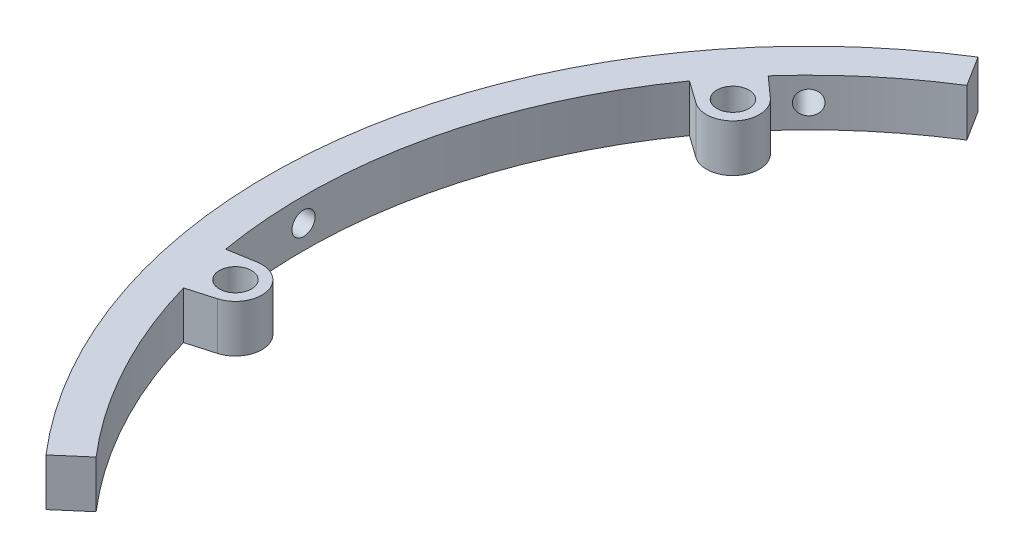
ISO-10303-21;
HEADER;
FILE_DESCRIPTION(('STEP AP214'),'2;1');
FILE_NAME('part.step','',(''),(''),'','','');
FILE_SCHEMA(('AUTOMOTIVE_DESIGN { 1 0 10303 214 1 1 1 1 }'));
ENDSEC;
DATA;
#1=APPLICATION_CONTEXT('core data for automotive mechanical design processes');
#2=APPLICATION_PROTOCOL_DEFINITION('international standard','automotive_design',2000,#1);
#3=PRODUCT_CONTEXT('',#1,'mechanical');
#4=PRODUCT('Part','Part','',(#3));
#5=PRODUCT_RELATED_PRODUCT_CATEGORY('part','',(#4));
#6=PRODUCT_DEFINITION_FORMATION('','',#4);
#7=PRODUCT_DEFINITION_CONTEXT('part definition',#1,'design');
#8=PRODUCT_DEFINITION('design','',#6,#7);
#9=PRODUCT_DEFINITION_SHAPE('','',#8);
#10=(LENGTH_UNIT() NAMED_UNIT(*) SI_UNIT(.MILLI.,.METRE.));
#11=(NAMED_UNIT(*) PLANE_ANGLE_UNIT() SI_UNIT($,.RADIAN.));
#12=(NAMED_UNIT(*) SI_UNIT($,.STERADIAN.) SOLID_ANGLE_UNIT());
#13=UNCERTAINTY_MEASURE_WITH_UNIT(LENGTH_MEASURE(1.E-05),#10,'distance_accuracy_value','');
#14=(GEOMETRIC_REPRESENTATION_CONTEXT(3) GLOBAL_UNCERTAINTY_ASSIGNED_CONTEXT((#13)) GLOBAL_UNIT_ASSIGNED_CONTEXT((#10,
#11,#12)) REPRESENTATION_CONTEXT('',''));
#15=CARTESIAN_POINT('',(0.,0.,0.));
#16=DIRECTION('',(0.,0.,1.));
#17=DIRECTION('',(1.,0.,0.));
#18=AXIS2_PLACEMENT_3D('',#15,#16,#17);
#19=CARTESIAN_POINT('',(0.,0.,0.));
#20=DIRECTION('',(0.,1.,0.));
#21=DIRECTION('',(0.,0.,1.));
#22=AXIS2_PLACEMENT_3D('',#19,#20,#21);
#23=PLANE('',#22);
#24=CARTESIAN_POINT('',(-62.5723357956977,0.,14.2817273227174));
#25=DIRECTION('',(0.,1.,0.));
#26=DIRECTION('',(0.,0.,1.));
#27=AXIS2_PLACEMENT_3D('',#24,#25,#26);
#28=CIRCLE('',#27,2.15265);
#29=CARTESIAN_POINT('',(-62.5723357956977,0.,16.4343773227174));
#30=VERTEX_POINT('',#29);
#31=EDGE_CURVE('E476',#30,#30,#28,.T.);
#32=ORIENTED_EDGE('',*,*,#31,.T.);
#33=EDGE_LOOP('',(#32));
#34=FACE_BOUND('',#33,.T.);
#35=CARTESIAN_POINT('',(-50.1791172920219,0.,-40.0165107179962));
#36=DIRECTION('',(0.,1.,0.));
#37=DIRECTION('',(0.,0.,1.));
#38=AXIS2_PLACEMENT_3D('',#35,#36,#37);
#39=CIRCLE('',#38,2.15265);
#40=CARTESIAN_POINT('',(-50.1791172920219,0.,-37.8638607179962));
#41=VERTEX_POINT('',#40);
#42=EDGE_CURVE('E409',#41,#41,#39,.T.);
#43=ORIENTED_EDGE('',*,*,#42,.T.);
#44=EDGE_LOOP('',(#43));
#45=FACE_BOUND('',#44,.T.);
#46=DIRECTION('',(-0.533066975566378,0.,-0.846073046232129));
#47=VECTOR('',#46,1.);
#48=CARTESIAN_POINT('',(1.64382710877289E-13,0.,-1.03569065239691E-13));
#49=LINE('',#48,#47);
#50=CARTESIAN_POINT('',(-36.1086242574274,0.,-57.310872969149));
#51=VERTEX_POINT('',#50);
#52=CARTESIAN_POINT('',(-38.6473557285622,0.,-61.3402958518295));
#53=VERTEX_POINT('',#52);
#54=EDGE_CURVE('E270',#51,#53,#49,.T.);
#55=ORIENTED_EDGE('',*,*,#54,.F.);
#56=CARTESIAN_POINT('',(0.,0.,0.));
#57=DIRECTION('',(0.,1.,0.));
#58=DIRECTION('',(0.,0.,1.));
#59=AXIS2_PLACEMENT_3D('',#56,#57,#58);
#60=CIRCLE('',#59,67.7375);
#61=CARTESIAN_POINT('',(-50.5379908631706,0.,-45.1029975252653));
#62=VERTEX_POINT('',#61);
#63=EDGE_CURVE('E295',#51,#62,#60,.T.);
#64=ORIENTED_EDGE('',*,*,#63,.T.);
#65=DIRECTION('',(-0.746085858839943,0.,-0.665849751249533));
#66=VECTOR('',#65,1.);
#67=CARTESIAN_POINT('',(0.,0.,0.));
#68=LINE('',#67,#66);
#69=CARTESIAN_POINT('',(-47.8113555765786,0.,-42.669592032031));
#70=VERTEX_POINT('',#69);
#71=EDGE_CURVE('E420',#70,#62,#68,.T.);
#72=ORIENTED_EDGE('',*,*,#71,.F.);
#73=CARTESIAN_POINT('',(-50.1791172920219,0.,-40.0165107179962));
#74=DIRECTION('',(0.,1.,0.));
#75=DIRECTION('',(0.,0.,1.));
#76=AXIS2_PLACEMENT_3D('',#73,#74,#75);
#77=CIRCLE('',#76,3.55600000000001);
#78=CARTESIAN_POINT('',(-52.238803770056,0.,-37.1177476003539));
#79=VERTEX_POINT('',#78);
#80=EDGE_CURVE('E416',#79,#70,#77,.T.);
#81=ORIENTED_EDGE('',*,*,#80,.F.);
#82=DIRECTION('',(-0.815175229933159,0.,-0.579214420144579));
#83=VECTOR('',#82,1.);
#84=CARTESIAN_POINT('',(0.,0.,0.));
#85=LINE('',#84,#83);
#86=CARTESIAN_POINT('',(-55.2179321375974,0.,-39.2345367845434));
#87=VERTEX_POINT('',#86);
#88=EDGE_CURVE('E413',#79,#87,#85,.T.);
#89=ORIENTED_EDGE('',*,*,#88,.T.);
#90=CARTESIAN_POINT('',(-66.7728653285467,0.,11.3909333272459));
#91=VERTEX_POINT('',#90);
#92=EDGE_CURVE('E301',#87,#91,#60,.T.);
#93=ORIENTED_EDGE('',*,*,#92,.T.);
#94=DIRECTION('',(-0.98575922241811,0.,0.168162883591009));
#95=VECTOR('',#94,1.);
#96=CARTESIAN_POINT('',(0.,0.,0.));
#97=LINE('',#96,#95);
#98=CARTESIAN_POINT('',(-63.1703230097473,0.,10.7763675277986));
#99=VERTEX_POINT('',#98);
#100=EDGE_CURVE('E406',#99,#91,#97,.T.);
#101=ORIENTED_EDGE('',*,*,#100,.F.);
#102=CARTESIAN_POINT('',(-62.5723357956977,0.,14.2817273227174));
#103=DIRECTION('',(0.,1.,0.));
#104=DIRECTION('',(0.781831482468031,0.,0.623489801858732));
#105=AXIS2_PLACEMENT_3D('',#102,#103,#104);
#106=CIRCLE('',#105,3.55600000000001);
#107=CARTESIAN_POINT('',(-61.5901850441883,0.,17.6994042971124));
#108=VERTEX_POINT('',#107);
#109=EDGE_CURVE('E394',#108,#99,#106,.T.);
#110=ORIENTED_EDGE('',*,*,#109,.F.);
#111=DIRECTION('',(-0.961101511359669,0.,0.276195374440196));
#112=VECTOR('',#111,1.);
#113=CARTESIAN_POINT('',(0.,0.,0.));
#114=LINE('',#113,#112);
#115=CARTESIAN_POINT('',(-65.1026136257256,0.,18.7087841761428));
#116=VERTEX_POINT('',#115);
#117=EDGE_CURVE('E391',#108,#116,#114,.T.);
#118=ORIENTED_EDGE('',*,*,#117,.T.);
#119=CARTESIAN_POINT('',(-51.325097149787,0.,44.2052407392486));
#120=VERTEX_POINT('',#119);
#121=EDGE_CURVE('E303',#116,#120,#60,.T.);
#122=ORIENTED_EDGE('',*,*,#121,.T.);
#123=DIRECTION('',(0.757705807710456,0.,-0.652596283288409));
#124=VECTOR('',#123,1.);
#125=CARTESIAN_POINT('',(0.,0.,0.));
#126=LINE('',#125,#124);
#127=CARTESIAN_POINT('',(-54.933671059008,0.,47.3132305384097));
#128=VERTEX_POINT('',#127);
#129=EDGE_CURVE('E293',#128,#120,#126,.T.);
#130=ORIENTED_EDGE('',*,*,#129,.F.);
#131=CARTESIAN_POINT('',(0.,0.,0.));
#132=DIRECTION('',(0.,1.,0.));
#133=DIRECTION('',(0.,0.,1.));
#134=AXIS2_PLACEMENT_3D('',#131,#132,#133);
#135=CIRCLE('',#134,72.5);
#136=EDGE_CURVE('E284',#53,#128,#135,.T.);
#137=ORIENTED_EDGE('',*,*,#136,.F.);
#138=EDGE_LOOP('',(#55,#64,#72,#81,#89,#93,#101,#110,#118,#122,#130,#137));
#139=FACE_BOUND('',#138,.T.);
#140=ADVANCED_FACE('F181',(#34,#45,#139),#23,.F.);
#141=CARTESIAN_POINT('',(0.,6.35,0.));
#142=DIRECTION('',(0.,-1.,0.));
#143=DIRECTION('',(0.,0.,-1.));
#144=AXIS2_PLACEMENT_3D('',#141,#142,#143);
#145=CYLINDRICAL_SURFACE('',#144,72.5);
#146=CARTESIAN_POINT('',(-72.4834291407353,3.175,-1.54999999999923));
#147=CARTESIAN_POINT('',(-72.4834293645865,3.08794649460173,-1.54999614282025));
#148=CARTESIAN_POINT('',(-72.4835876536211,3.00083012041106,-1.54264153620552));
#149=CARTESIAN_POINT('',(-72.4842038709039,2.82899733465025,-1.51340502004667));
#150=CARTESIAN_POINT('',(-72.4846621584129,2.74428392779969,-1.4915056921288));
#151=CARTESIAN_POINT('',(-72.4858264336809,2.57977132169415,-1.43380409898447));
#152=CARTESIAN_POINT('',(-72.4865323016569,2.49996976792119,-1.39800855605564));
#153=CARTESIAN_POINT('',(-72.4881120469524,2.34753098072984,-1.31354007886273));
#154=CARTESIAN_POINT('',(-72.4889858828685,2.27489198843442,-1.264870316926));
#155=CARTESIAN_POINT('',(-72.4908034158351,2.13879576893882,-1.15601689632958));
#156=CARTESIAN_POINT('',(-72.4917471301172,2.07534081796946,-1.09583039184134));
#157=CARTESIAN_POINT('',(-72.4935978984021,1.95943283628672,-0.965656199914587));
#158=CARTESIAN_POINT('',(-72.4945049509538,1.90698024070692,-0.895668125014984));
#159=CARTESIAN_POINT('',(-72.4961801785539,1.81456501832349,-0.747872466119339));
#160=CARTESIAN_POINT('',(-72.4969483428901,1.77460335476172,-0.670064279684264));
#161=CARTESIAN_POINT('',(-72.4982590994414,1.70831080012777,-0.508841465811591));
#162=CARTESIAN_POINT('',(-72.4988016923388,1.68197986782065,-0.425426855335101));
#163=CARTESIAN_POINT('',(-72.4996000652003,1.64370000370054,-0.255372498846873));
#164=CARTESIAN_POINT('',(-72.4998558890496,1.63174887127802,-0.168733248409883));
#165=CARTESIAN_POINT('',(-72.5000520309418,1.62256109160158,0.00532212861477915));
#166=CARTESIAN_POINT('',(-72.4999923499038,1.62532440148241,0.0927382529385673));
#167=CARTESIAN_POINT('',(-72.4995642484993,1.64548516364501,0.265851019051876));
#168=CARTESIAN_POINT('',(-72.4991958785157,1.66288022779647,0.351547939105494));
#169=CARTESIAN_POINT('',(-72.4981919804269,1.71180702970131,0.518804911355798));
#170=CARTESIAN_POINT('',(-72.4975564518844,1.74333879059684,0.600364956780068));
#171=CARTESIAN_POINT('',(-72.4960897888275,1.81964664619961,0.75704059225386));
#172=CARTESIAN_POINT('',(-72.4952586381378,1.86442383619415,0.832155648693238));
#173=CARTESIAN_POINT('',(-72.4934944179147,1.96595064697222,0.973803170030416));
#174=CARTESIAN_POINT('',(-72.4925613482832,2.02270027926998,1.040335626674));
#175=CARTESIAN_POINT('',(-72.4906982443746,2.14657458709075,1.16294326893115));
#176=CARTESIAN_POINT('',(-72.4897682107427,2.21370133764071,1.21901635811186));
#177=CARTESIAN_POINT('',(-72.4880162203671,2.35641705236178,1.31909740104073));
#178=CARTESIAN_POINT('',(-72.4871942636392,2.43200601776742,1.36310535302875));
#179=CARTESIAN_POINT('',(-72.4857511159742,2.58950158845738,1.43780663410852));
#180=CARTESIAN_POINT('',(-72.4851299260122,2.67140822442425,1.46849989853107));
#181=CARTESIAN_POINT('',(-72.4841583933322,2.8392135494842,1.51569918892468));
#182=CARTESIAN_POINT('',(-72.4838080502336,2.92511223296613,1.53220523483641));
#183=CARTESIAN_POINT('',(-72.4834177797798,3.09844504439566,1.55055897105741));
#184=CARTESIAN_POINT('',(-72.4833777909707,3.18587886493088,1.5524095633242));
#185=CARTESIAN_POINT('',(-72.4836125774907,3.35981599439132,1.54140741931125));
#186=CARTESIAN_POINT('',(-72.4838873526415,3.44631930384314,1.52855469135289));
#187=CARTESIAN_POINT('',(-72.4847206340846,3.61593178136506,1.48851315536335));
#188=CARTESIAN_POINT('',(-72.485279114334,3.69904126021759,1.4613256631923));
#189=CARTESIAN_POINT('',(-72.4866168228585,3.85951639847273,1.39338769993699));
#190=CARTESIAN_POINT('',(-72.4873960513454,3.93688205236578,1.3526372158431));
#191=CARTESIAN_POINT('',(-72.4890875594073,4.08368675544547,1.25872255610789));
#192=CARTESIAN_POINT('',(-72.489999859929,4.15312455364386,1.20555642534019));
#193=CARTESIAN_POINT('',(-72.4918545883852,4.28208988758413,1.08832254576978));
#194=CARTESIAN_POINT('',(-72.4927970163648,4.3416174085159,1.02425478067574));
#195=CARTESIAN_POINT('',(-72.4946059325317,4.44908205447166,0.887023883352549));
#196=CARTESIAN_POINT('',(-72.4954724084378,4.4970173072617,0.813859284805302));
#197=CARTESIAN_POINT('',(-72.4970315640006,4.5799238719632,0.660519162219565));
#198=CARTESIAN_POINT('',(-72.4977242439467,4.61489520545833,0.580343649853848));
#199=CARTESIAN_POINT('',(-72.4988576608027,4.67087795671412,0.415264676914085));
#200=CARTESIAN_POINT('',(-72.4992984197022,4.69189059292011,0.330361629704772));
#201=CARTESIAN_POINT('',(-72.4998783935025,4.71936348126115,0.158231752679397));
#202=CARTESIAN_POINT('',(-72.5000176082698,4.72582372695725,0.0710049218351581));
#203=CARTESIAN_POINT('',(-72.4999788002703,4.72400828086903,-0.103277565910435));
#204=CARTESIAN_POINT('',(-72.4998008412853,4.71573555180286,-0.190333253703454));
#205=CARTESIAN_POINT('',(-72.4991478683034,4.68469505478808,-0.361819908355045));
#206=CARTESIAN_POINT('',(-72.4986728537133,4.66192725789381,-0.446250869971867));
#207=CARTESIAN_POINT('',(-72.4974792926782,4.60254306436209,-0.61009317468893));
#208=CARTESIAN_POINT('',(-72.4967607418624,4.56592641917408,-0.689504427668684));
#209=CARTESIAN_POINT('',(-72.495161113077,4.47988573773347,-0.841049986484441));
#210=CARTESIAN_POINT('',(-72.4942800412333,4.4304621841738,-0.913184566436236));
#211=CARTESIAN_POINT('',(-72.4924545323763,4.32020487244231,-1.04814092501514));
#212=CARTESIAN_POINT('',(-72.4915100893709,4.259370034242,-1.11096182113414));
#213=CARTESIAN_POINT('',(-72.4896641177195,4.12799946117098,-1.22551534310395));
#214=CARTESIAN_POINT('',(-72.4887625997776,4.05746132352265,-1.2772452143988));
#215=CARTESIAN_POINT('',(-72.4871039054881,3.90866644071328,-1.36815287585741));
#216=CARTESIAN_POINT('',(-72.4863468108306,3.83040536497478,-1.40732357065338));
#217=CARTESIAN_POINT('',(-72.4850639247928,3.66847699154491,-1.47192448421265));
#218=CARTESIAN_POINT('',(-72.4845378570074,3.58481629234224,-1.49737113105871));
#219=CARTESIAN_POINT('',(-72.4839173367443,3.44635399571503,-1.52703905523155));
#220=CARTESIAN_POINT('',(-72.4837350553076,3.39245161287714,-1.53563861886166));
#221=CARTESIAN_POINT('',(-72.4834908871985,3.28404104348803,-1.54712029894721));
#222=CARTESIAN_POINT('',(-72.4834290005084,3.22953285702646,-1.55000241624875));
#223=CARTESIAN_POINT('',(-72.4834291407353,3.175,-1.54999999999923));
#224=B_SPLINE_CURVE_WITH_KNOTS('',3,(#146,#147,#148,#149,#150,#151,#152,#153,#154,#155,#156,
#157,#158,#159,#160,#161,#162,#163,#164,#165,#166,#167,#168,#169,#170,#171,#172,#173,#174,#175,
#176,#177,#178,#179,#180,#181,#182,#183,#184,#185,#186,#187,#188,#189,#190,#191,#192,#193,#194,
#195,#196,#197,#198,#199,#200,#201,#202,#203,#204,#205,#206,#207,#208,#209,#210,#211,#212,#213,
#214,#215,#216,#217,#218,#219,#220,#221,#222,#223),.UNSPECIFIED.,.T.,.F.,(4,2,2,2,2,2,2,2,2,2,2,
2,2,2,2,2,2,2,2,2,2,2,2,2,2,2,2,2,2,2,2,2,2,2,2,2,2,2,4),(0.,0.260961467730006,0.5222360208926,
0.783384339603371,1.04446836878509,1.30561699627782,1.56677595002482,1.8279550381546,
2.08913333617518,2.35027165974638,2.61140922258508,2.87250417197238,3.13359954878047,
3.39471652205229,3.65583374644848,3.91700325200672,4.17817279566597,4.43934360780693,
4.70051405286184,4.96163278170856,5.22275136277463,5.48384597862437,5.74494084491685,
6.0060768543015,6.26721325392965,6.52839180082345,6.78956991287811,7.05072522387355,
7.31188065042123,7.57298356601472,7.83408700301443,8.09519512635978,8.35629340995983,
8.6174164178575,8.87860420307646,9.13993928865742,9.40096085032046,9.56443475582261,
9.72790863713305),.UNSPECIFIED.);
#225=CARTESIAN_POINT('',(-72.4834291407353,3.175,-1.54999999999923));
#226=VERTEX_POINT('',#225);
#227=EDGE_CURVE('E335',#226,#226,#224,.T.);
#228=ORIENTED_EDGE('',*,*,#227,.F.);
#229=EDGE_LOOP('',(#228));
#230=FACE_BOUND('',#229,.T.);
#231=CARTESIAN_POINT('',(-50.1575087582299,3.175,-52.3495397799073));
#232=CARTESIAN_POINT('',(-50.157511643954,3.08794649460173,-52.3495372107565));
#233=CARTESIAN_POINT('',(-50.162824063414,3.00083012041106,-52.3444486457961));
#234=CARTESIAN_POINT('',(-50.1839331336675,2.82899733465024,-52.3242110383812));
#235=CARTESIAN_POINT('',(-50.199742355147,2.74428392779969,-52.3090499333124));
#236=CARTESIAN_POINT('',(-50.2413668098818,2.57977132169415,-52.2690720124519));
#237=CARTESIAN_POINT('',(-50.2671772050555,2.49996976792119,-52.2442598653431));
#238=CARTESIAN_POINT('',(-50.328022486686,2.34753098072984,-52.1856486809345));
#239=CARTESIAN_POINT('',(-50.3630551006922,2.27489198843442,-52.1518518575323));
#240=CARTESIAN_POINT('',(-50.4413112824369,2.13879576893882,-52.0761660555589));
#241=CARTESIAN_POINT('',(-50.4845368746649,2.07534081796946,-52.0342750768677));
#242=CARTESIAN_POINT('',(-50.5778926193165,1.95943283628672,-51.9435367138255));
#243=CARTESIAN_POINT('',(-50.6280230446903,1.90698024070691,-51.894689054472));
#244=CARTESIAN_POINT('',(-50.7337149221215,1.81456501832349,-51.791366306633));
#245=CARTESIAN_POINT('',(-50.7892767925927,1.77460335476172,-51.7368907845842));
#246=CARTESIAN_POINT('',(-50.90420538241,1.70831080012777,-51.6238158844587));
#247=CARTESIAN_POINT('',(-50.9635720902451,1.68197986782066,-51.5652165188579));
#248=CARTESIAN_POINT('',(-51.0843832137525,1.64370000370054,-51.445534465079));
#249=CARTESIAN_POINT('',(-51.1458273100321,1.63174887127802,-51.3844521583567));
#250=CARTESIAN_POINT('',(-51.2690417406902,1.62256109160158,-51.2615151142227));
#251=CARTESIAN_POINT('',(-51.330812074118,1.62532440148241,-51.1996603790616));
#252=CARTESIAN_POINT('',(-51.4529185715405,1.64548516364501,-51.0769484548268));
#253=CARTESIAN_POINT('',(-51.5132549679238,1.66288022779647,-51.0160911046166));
#254=CARTESIAN_POINT('',(-51.6308136440565,1.71180702970131,-50.8971127021915));
#255=CARTESIAN_POINT('',(-51.6880359187079,1.74333879059684,-50.8389916544561));
#256=CARTESIAN_POINT('',(-51.7977852356048,1.81964664619961,-50.7271681627726));
#257=CARTESIAN_POINT('',(-51.8503118890935,1.86442383619415,-50.6734660847063));
#258=CARTESIAN_POINT('',(-51.949224319886,1.96595064697223,-50.5720586697473));
#259=CARTESIAN_POINT('',(-51.995610091284,2.02270027926998,-50.5243533386218));
#260=CARTESIAN_POINT('',(-52.0809893731414,2.14657458709076,-50.4363392299487));
#261=CARTESIAN_POINT('',(-52.1199814016553,2.21370133764071,-50.396031935259));
#262=CARTESIAN_POINT('',(-52.1895105415034,2.35641705236178,-50.3240251068606));
#263=CARTESIAN_POINT('',(-52.2200476516041,2.43200601776742,-50.2923255744077));
#264=CARTESIAN_POINT('',(-52.2718489745188,2.58950158845738,-50.2384833324927));
#265=CARTESIAN_POINT('',(-52.2931131422942,2.67140822442425,-50.2163406694482));
#266=CARTESIAN_POINT('',(-52.3258011032525,2.8392135494842,-50.1822787537975));
#267=CARTESIAN_POINT('',(-52.3372249102665,2.92511223296613,-50.170359486822));
#268=CARTESIAN_POINT('',(-52.3499269987241,3.09844504439566,-50.1571054725956));
#269=CARTESIAN_POINT('',(-52.3512072887071,3.18587886493088,-50.1557686298965));
#270=CARTESIAN_POINT('',(-52.3435936172084,3.35981599439132,-50.163714339676));
#271=CARTESIAN_POINT('',(-52.3346996614847,3.44631930384314,-50.1729968861446));
#272=CARTESIAN_POINT('',(-52.3069752388164,3.61593178136506,-50.201899746731));
#273=CARTESIAN_POINT('',(-52.2881456839103,3.69904126021759,-50.2215191119801));
#274=CARTESIAN_POINT('',(-52.2410521921614,3.85951639847274,-50.2705044092668));
#275=CARTESIAN_POINT('',(-52.2127882462692,3.93688205236578,-50.2998703506534));
#276=CARTESIAN_POINT('',(-52.1475766303386,4.08368675544547,-50.367474120226));
#277=CARTESIAN_POINT('',(-52.1106275926286,4.15312455364386,-50.4057133457067));
#278=CARTESIAN_POINT('',(-52.0290422124683,4.28208988758414,-50.4899217080044));
#279=CARTESIAN_POINT('',(-51.9844058585299,4.3416174085159,-50.535890856373));
#280=CARTESIAN_POINT('',(-51.8886480573326,4.44908205447166,-50.6342068513467));
#281=CARTESIAN_POINT('',(-51.837525564546,4.4970173072617,-50.6865547261112));
#282=CARTESIAN_POINT('',(-51.730200213509,4.5799238719632,-50.796085056091));
#283=CARTESIAN_POINT('',(-51.6739973637172,4.61489520545833,-50.853267503257));
#284=CARTESIAN_POINT('',(-51.558070349265,4.67087795671412,-50.9707974111988));
#285=CARTESIAN_POINT('',(-51.4983464924466,4.69189059292012,-51.0311445952306));
#286=CARTESIAN_POINT('',(-51.3770423925642,4.71936348126115,-51.1532689019271));
#287=CARTESIAN_POINT('',(-51.3154621486789,4.72582372695725,-51.2150460252245));
#288=CARTESIAN_POINT('',(-51.1921983783523,4.72400828086903,-51.3382549127519));
#289=CARTESIAN_POINT('',(-51.1305148751679,4.71573555180286,-51.3996867439261));
#290=CARTESIAN_POINT('',(-51.0087937771574,4.68469505478808,-51.5204843986898));
#291=CARTESIAN_POINT('',(-50.9487561856182,4.66192725789381,-51.5798502181533));
#292=CARTESIAN_POINT('',(-50.8320582058058,4.60254306436209,-51.6948602477623));
#293=CARTESIAN_POINT('',(-50.7753978781668,4.56592641917408,-51.7505043910924));
#294=CARTESIAN_POINT('',(-50.667107877508,4.47988573773346,-51.8565321750282));
#295=CARTESIAN_POINT('',(-50.6154780149906,4.4304621841738,-51.9069160137947));
#296=CARTESIAN_POINT('',(-50.5187586289833,4.3202048724423,-52.0010537404182));
#297=CARTESIAN_POINT('',(-50.4736697252838,4.259370034242,-52.0448070000106));
#298=CARTESIAN_POINT('',(-50.3913628540176,4.12799946117098,-52.1245032731317));
#299=CARTESIAN_POINT('',(-50.354146841785,4.05746132352265,-52.160444346464));
#300=CARTESIAN_POINT('',(-50.2886925439257,3.90866644071328,-52.2235528963632));
#301=CARTESIAN_POINT('',(-50.2604593332454,3.83040536497478,-52.2507154135109));
#302=CARTESIAN_POINT('',(-50.21387245178,3.66847699154491,-52.2954880201427));
#303=CARTESIAN_POINT('',(-50.1955069691383,3.58481629234224,-52.3131095305876));
#304=CARTESIAN_POINT('',(-50.174089804686,3.44635399571503,-52.3336491468681));
#305=CARTESIAN_POINT('',(-50.1678801024879,3.39245161287714,-52.3396010641861));
#306=CARTESIAN_POINT('',(-50.1595886757144,3.28404104348803,-52.3475471851084));
#307=CARTESIAN_POINT('',(-50.1575069505281,3.22953285702646,-52.3495413892983));
#308=CARTESIAN_POINT('',(-50.1575087582299,3.175,-52.3495397799073));
#309=B_SPLINE_CURVE_WITH_KNOTS('',3,(#231,#232,#233,#234,#235,#236,#237,#238,#239,#240,#241,
#242,#243,#244,#245,#246,#247,#248,#249,#250,#251,#252,#253,#254,#255,#256,#257,#258,#259,#260,
#261,#262,#263,#264,#265,#266,#267,#268,#269,#270,#271,#272,#273,#274,#275,#276,#277,#278,#279,
#280,#281,#282,#283,#284,#285,#286,#287,#288,#289,#290,#291,#292,#293,#294,#295,#296,#297,#298,
#299,#300,#301,#302,#303,#304,#305,#306,#307,#308),.UNSPECIFIED.,.T.,.F.,(4,2,2,2,2,2,2,2,2,2,2,
2,2,2,2,2,2,2,2,2,2,2,2,2,2,2,2,2,2,2,2,2,2,2,2,2,2,2,4),(0.,0.260961467730007,0.5222360208926,
0.78338433960337,1.04446836878509,1.30561699627782,1.56677595002482,1.8279550381546,
2.08913333617518,2.35027165974639,2.61140922258508,2.87250417197238,3.13359954878048,
3.3947165220523,3.65583374644849,3.91700325200672,4.17817279566597,4.43934360780693,
4.70051405286184,4.96163278170856,5.22275136277463,5.48384597862437,5.74494084491685,
6.00607685430151,6.26721325392965,6.52839180082346,6.78956991287811,7.05072522387355,
7.31188065042123,7.57298356601472,7.83408700301443,8.09519512635977,8.35629340995983,
8.61741641785749,8.87860420307645,9.13993928865742,9.40096085032046,9.5644347558226,
9.72790863713305),.UNSPECIFIED.);
#310=CARTESIAN_POINT('',(-50.1575087582299,3.175,-52.3495397799073));
#311=VERTEX_POINT('',#310);
#312=EDGE_CURVE('E312',#311,#311,#309,.T.);
#313=ORIENTED_EDGE('',*,*,#312,.F.);
#314=EDGE_LOOP('',(#313));
#315=FACE_BOUND('',#314,.T.);
#316=DIRECTION('',(0.,1.,0.));
#317=VECTOR('',#316,1.);
#318=CARTESIAN_POINT('',(-38.6473557285622,0.,-61.3402958518295));
#319=LINE('',#318,#317);
#320=CARTESIAN_POINT('',(-38.6473557285622,6.35,-61.3402958518295));
#321=VERTEX_POINT('',#320);
#322=EDGE_CURVE('E273',#53,#321,#319,.T.);
#323=ORIENTED_EDGE('',*,*,#322,.F.);
#324=ORIENTED_EDGE('',*,*,#136,.T.);
#325=DIRECTION('',(0.,1.,0.));
#326=VECTOR('',#325,1.);
#327=CARTESIAN_POINT('',(-54.933671059008,0.,47.3132305384097));
#328=LINE('',#327,#326);
#329=CARTESIAN_POINT('',(-54.933671059008,6.35,47.3132305384097));
#330=VERTEX_POINT('',#329);
#331=EDGE_CURVE('E289',#128,#330,#328,.T.);
#332=ORIENTED_EDGE('',*,*,#331,.T.);
#333=CARTESIAN_POINT('',(0.,6.35,0.));
#334=DIRECTION('',(0.,1.,0.));
#335=DIRECTION('',(0.,0.,1.));
#336=AXIS2_PLACEMENT_3D('',#333,#334,#335);
#337=CIRCLE('',#336,72.5);
#338=EDGE_CURVE('E287',#321,#330,#337,.T.);
#339=ORIENTED_EDGE('',*,*,#338,.F.);
#340=EDGE_LOOP('',(#323,#324,#332,#339));
#341=FACE_BOUND('',#340,.T.);
#342=ADVANCED_FACE('F282',(#230,#315,#341),#145,.T.);
#343=CARTESIAN_POINT('',(0.,6.35,0.));
#344=DIRECTION('',(0.,-1.,0.));
#345=DIRECTION('',(0.,0.,-1.));
#346=AXIS2_PLACEMENT_3D('',#343,#344,#345);
#347=CYLINDRICAL_SURFACE('',#346,67.7375);
#348=CARTESIAN_POINT('',(0.,6.35,0.));
#349=DIRECTION('',(0.,1.,0.));
#350=DIRECTION('',(0.,0.,1.));
#351=AXIS2_PLACEMENT_3D('',#348,#349,#350);
#352=CIRCLE('',#351,67.7375);
#353=CARTESIAN_POINT('',(-65.1026136257256,6.35,18.7087841761428));
#354=VERTEX_POINT('',#353);
#355=CARTESIAN_POINT('',(-51.325097149787,6.35,44.2052407392486));
#356=VERTEX_POINT('',#355);
#357=EDGE_CURVE('E294',#354,#356,#352,.T.);
#358=ORIENTED_EDGE('',*,*,#357,.T.);
#359=DIRECTION('',(0.,1.,0.));
#360=VECTOR('',#359,1.);
#361=CARTESIAN_POINT('',(-51.325097149787,0.,44.2052407392486));
#362=LINE('',#361,#360);
#363=EDGE_CURVE('E197',#120,#356,#362,.T.);
#364=ORIENTED_EDGE('',*,*,#363,.F.);
#365=ORIENTED_EDGE('',*,*,#121,.F.);
#366=DIRECTION('',(0.,1.,0.));
#367=VECTOR('',#366,1.);
#368=CARTESIAN_POINT('',(-65.1026136257256,0.,18.7087841761428));
#369=LINE('',#368,#367);
#370=EDGE_CURVE('E204',#116,#354,#369,.T.);
#371=ORIENTED_EDGE('',*,*,#370,.T.);
#372=EDGE_LOOP('',(#358,#364,#365,#371));
#373=FACE_BOUND('',#372,.T.);
#374=ADVANCED_FACE('F183',(#373),#347,.F.);
#375=CARTESIAN_POINT('',(0.,6.35,0.));
#376=DIRECTION('',(0.,1.,0.));
#377=DIRECTION('',(0.,0.,1.));
#378=AXIS2_PLACEMENT_3D('',#375,#376,#377);
#379=PLANE('',#378);
#380=CARTESIAN_POINT('',(-50.1791172920219,6.35,-40.0165107179962));
#381=DIRECTION('',(0.,1.,0.));
#382=DIRECTION('',(0.,0.,1.));
#383=AXIS2_PLACEMENT_3D('',#380,#381,#382);
#384=CIRCLE('',#383,2.15265);
#385=CARTESIAN_POINT('',(-50.1791172920219,6.35,-37.8638607179962));
#386=VERTEX_POINT('',#385);
#387=EDGE_CURVE('E401',#386,#386,#384,.T.);
#388=ORIENTED_EDGE('',*,*,#387,.F.);
#389=EDGE_LOOP('',(#388));
#390=FACE_BOUND('',#389,.T.);
#391=CARTESIAN_POINT('',(-62.5723357956977,6.35,14.2817273227174));
#392=DIRECTION('',(0.,1.,0.));
#393=DIRECTION('',(0.,0.,1.));
#394=AXIS2_PLACEMENT_3D('',#391,#392,#393);
#395=CIRCLE('',#394,2.15265);
#396=CARTESIAN_POINT('',(-62.5723357956977,6.35,16.4343773227174));
#397=VERTEX_POINT('',#396);
#398=EDGE_CURVE('E474',#397,#397,#395,.T.);
#399=ORIENTED_EDGE('',*,*,#398,.F.);
#400=EDGE_LOOP('',(#399));
#401=FACE_BOUND('',#400,.T.);
#402=ORIENTED_EDGE('',*,*,#338,.T.);
#403=DIRECTION('',(0.757705807710456,0.,-0.652596283288409));
#404=VECTOR('',#403,1.);
#405=CARTESIAN_POINT('',(0.,6.35,0.));
#406=LINE('',#405,#404);
#407=EDGE_CURVE('E12',#330,#356,#406,.T.);
#408=ORIENTED_EDGE('',*,*,#407,.T.);
#409=ORIENTED_EDGE('',*,*,#357,.F.);
#410=DIRECTION('',(-0.961101511359669,0.,0.276195374440196));
#411=VECTOR('',#410,1.);
#412=CARTESIAN_POINT('',(0.,6.35,0.));
#413=LINE('',#412,#411);
#414=CARTESIAN_POINT('',(-61.5901850441883,6.35,17.6994042971124));
#415=VERTEX_POINT('',#414);
#416=EDGE_CURVE('E396',#415,#354,#413,.T.);
#417=ORIENTED_EDGE('',*,*,#416,.F.);
#418=CARTESIAN_POINT('',(-62.5723357956977,6.35,14.2817273227174));
#419=DIRECTION('',(0.,1.,0.));
#420=DIRECTION('',(0.781831482468031,0.,0.623489801858732));
#421=AXIS2_PLACEMENT_3D('',#418,#419,#420);
#422=CIRCLE('',#421,3.55600000000001);
#423=CARTESIAN_POINT('',(-63.1703230097473,6.35,10.7763675277986));
#424=VERTEX_POINT('',#423);
#425=EDGE_CURVE('E392',#415,#424,#422,.T.);
#426=ORIENTED_EDGE('',*,*,#425,.T.);
#427=DIRECTION('',(-0.98575922241811,0.,0.168162883591009));
#428=VECTOR('',#427,1.);
#429=CARTESIAN_POINT('',(0.,6.35,0.));
#430=LINE('',#429,#428);
#431=CARTESIAN_POINT('',(-66.7728653285467,6.35,11.3909333272459));
#432=VERTEX_POINT('',#431);
#433=EDGE_CURVE('E382',#424,#432,#430,.T.);
#434=ORIENTED_EDGE('',*,*,#433,.T.);
#435=CARTESIAN_POINT('',(-55.2179321375974,6.35,-39.2345367845434));
#436=VERTEX_POINT('',#435);
#437=EDGE_CURVE('E298',#436,#432,#352,.T.);
#438=ORIENTED_EDGE('',*,*,#437,.F.);
#439=DIRECTION('',(-0.815175229933159,0.,-0.579214420144579));
#440=VECTOR('',#439,1.);
#441=CARTESIAN_POINT('',(0.,6.35,0.));
#442=LINE('',#441,#440);
#443=CARTESIAN_POINT('',(-52.238803770056,6.35,-37.1177476003539));
#444=VERTEX_POINT('',#443);
#445=EDGE_CURVE('E412',#444,#436,#442,.T.);
#446=ORIENTED_EDGE('',*,*,#445,.F.);
#447=CARTESIAN_POINT('',(-50.1791172920219,6.35,-40.0165107179962));
#448=DIRECTION('',(0.,1.,0.));
#449=DIRECTION('',(0.,0.,1.));
#450=AXIS2_PLACEMENT_3D('',#447,#448,#449);
#451=CIRCLE('',#450,3.55600000000001);
#452=CARTESIAN_POINT('',(-47.8113555765786,6.35,-42.669592032031));
#453=VERTEX_POINT('',#452);
#454=EDGE_CURVE('E424',#444,#453,#451,.T.);
#455=ORIENTED_EDGE('',*,*,#454,.T.);
#456=DIRECTION('',(-0.746085858839943,0.,-0.665849751249533));
#457=VECTOR('',#456,1.);
#458=CARTESIAN_POINT('',(0.,6.35,0.));
#459=LINE('',#458,#457);
#460=CARTESIAN_POINT('',(-50.5379908631706,6.35,-45.1029975252653));
#461=VERTEX_POINT('',#460);
#462=EDGE_CURVE('E417',#453,#461,#459,.T.);
#463=ORIENTED_EDGE('',*,*,#462,.T.);
#464=CARTESIAN_POINT('',(-36.1086242574274,6.35,-57.3108729691489));
#465=VERTEX_POINT('',#464);
#466=EDGE_CURVE('E300',#465,#461,#352,.T.);
#467=ORIENTED_EDGE('',*,*,#466,.F.);
#468=DIRECTION('',(0.533066975566378,0.,0.846073046232129));
#469=VECTOR('',#468,1.);
#470=CARTESIAN_POINT('',(1.64382710877289E-13,6.35,-1.03569065239691E-13));
#471=LINE('',#470,#469);
#472=EDGE_CURVE('E438',#321,#465,#471,.T.);
#473=ORIENTED_EDGE('',*,*,#472,.F.);
#474=EDGE_LOOP('',(#402,#408,#409,#417,#426,#434,#438,#446,#455,#463,#467,#473));
#475=FACE_BOUND('',#474,.T.);
#476=ADVANCED_FACE('F347',(#390,#401,#475),#379,.T.);
#477=DIRECTION('',(0.,1.,0.));
#478=VECTOR('',#477,1.);
#479=CARTESIAN_POINT('',(-66.7728653285467,0.,11.3909333272459));
#480=LINE('',#479,#478);
#481=EDGE_CURVE('E386',#91,#432,#480,.T.);
#482=ORIENTED_EDGE('',*,*,#481,.F.);
#483=ORIENTED_EDGE('',*,*,#92,.F.);
#484=DIRECTION('',(0.,1.,0.));
#485=VECTOR('',#484,1.);
#486=CARTESIAN_POINT('',(-55.2179321375974,0.,-39.2345367845434));
#487=LINE('',#486,#485);
#488=EDGE_CURVE('E422',#87,#436,#487,.T.);
#489=ORIENTED_EDGE('',*,*,#488,.T.);
#490=ORIENTED_EDGE('',*,*,#437,.T.);
#491=EDGE_LOOP('',(#482,#483,#489,#490));
#492=FACE_BOUND('',#491,.T.);
#493=CARTESIAN_POINT('',(-67.7197637787522,3.175,-1.54999999999928));
#494=CARTESIAN_POINT('',(-67.7197640183039,3.0879480485659,-1.54999614335584));
#495=CARTESIAN_POINT('',(-67.7199334360242,3.00083326632243,-1.54264179827543));
#496=CARTESIAN_POINT('',(-67.7205929752941,2.82900372720776,-1.51340638150849));
#497=CARTESIAN_POINT('',(-67.7210834811437,2.74429197336334,-1.49150790195924));
#498=CARTESIAN_POINT('',(-67.7223296027441,2.57978268170764,-1.43380869487533));
#499=CARTESIAN_POINT('',(-67.7230850900661,2.49998278524849,-1.39801470119182));
#500=CARTESIAN_POINT('',(-67.7247758816002,2.34754698395736,-1.31355001413555));
#501=CARTESIAN_POINT('',(-67.7257111415595,2.27490932272111,-1.26488248859089));
#502=CARTESIAN_POINT('',(-67.7276564553071,2.13881375061252,-1.15603297122475));
#503=CARTESIAN_POINT('',(-67.7286665290883,2.0753583070531,-1.09584789462576));
#504=CARTESIAN_POINT('',(-67.730647444844,1.95944898355979,-0.965676473024787));
#505=CARTESIAN_POINT('',(-67.7316182852638,1.90699553919405,-0.895689740159003));
#506=CARTESIAN_POINT('',(-67.7334113452781,1.81457759191281,-0.747895424938478));
#507=CARTESIAN_POINT('',(-67.7342335513344,1.77461422639076,-0.670087131175243));
#508=CARTESIAN_POINT('',(-67.7356365317938,1.70831839767953,-0.508863530165587));
#509=CARTESIAN_POINT('',(-67.7362173069628,1.68198589124173,-0.425448240710255));
#510=CARTESIAN_POINT('',(-67.7370718643253,1.64370362766064,-0.255393968730592));
#511=CARTESIAN_POINT('',(-67.7373457004093,1.63175134569489,-0.168755554864262));
#512=CARTESIAN_POINT('',(-67.7375556900662,1.62256104748218,0.00529840157261657));
#513=CARTESIAN_POINT('',(-67.7374918446775,1.62532298599173,0.0927139417528208));
#514=CARTESIAN_POINT('',(-67.7370337157354,1.64548055717709,0.26582361624817));
#515=CARTESIAN_POINT('',(-67.7366394939727,1.66287345340773,0.351518069391814));
#516=CARTESIAN_POINT('',(-67.7355651195744,1.71179499299021,0.518770472496439));
#517=CARTESIAN_POINT('',(-67.7348849664465,1.74332366067478,0.600328415336739));
#518=CARTESIAN_POINT('',(-67.7333152901821,1.8196248922419,0.757001401393133));
#519=CARTESIAN_POINT('',(-67.7324257472075,1.8643987110999,0.832115833217473));
#520=CARTESIAN_POINT('',(-67.7305375573615,1.9659183225179,0.973762830737537));
#521=CARTESIAN_POINT('',(-67.7295389103634,2.02266412897242,1.04029538647311));
#522=CARTESIAN_POINT('',(-67.7275448052953,2.14653240740608,1.16290597823561));
#523=CARTESIAN_POINT('',(-67.726549348009,2.21365725623728,1.21898161307068));
#524=CARTESIAN_POINT('',(-67.7246740822463,2.35636978182703,1.3190680820268));
#525=CARTESIAN_POINT('',(-67.723794273787,2.43195745984189,1.36307891435682));
#526=CARTESIAN_POINT('',(-67.7222495212612,2.5894512824477,1.43778617877829));
#527=CARTESIAN_POINT('',(-67.7215845783996,2.67135746246989,1.4684825362019));
#528=CARTESIAN_POINT('',(-67.7205445820213,2.83916264061179,1.51568795200379));
#529=CARTESIAN_POINT('',(-67.7201695280397,2.92506163232756,1.53219703313572));
#530=CARTESIAN_POINT('',(-67.7197516797293,3.09839316723052,1.55055631938268));
#531=CARTESIAN_POINT('',(-67.7197088100509,3.18582535813064,1.55240984883212));
#532=CARTESIAN_POINT('',(-67.7199599673505,3.3597597142689,1.54141407625839));
#533=CARTESIAN_POINT('',(-67.7202539941079,3.44626188011612,1.52856478386496));
#534=CARTESIAN_POINT('',(-67.7211457285337,3.61587141330346,1.48853086799811));
#535=CARTESIAN_POINT('',(-67.721743404258,3.69897913674752,1.46134775244002));
#536=CARTESIAN_POINT('',(-67.7231750302882,3.85945155265133,1.39341936046542));
#537=CARTESIAN_POINT('',(-67.7240089808582,3.93681623869284,1.35267406889256));
#538=CARTESIAN_POINT('',(-67.7258193251947,4.08362177045758,1.25876937446204));
#539=CARTESIAN_POINT('',(-67.726795744648,4.1530611832452,1.20560773193238));
#540=CARTESIAN_POINT('',(-67.7287808585721,4.28203063837518,1.0883826986095));
#541=CARTESIAN_POINT('',(-67.7297895530962,4.34156066433506,1.02431928979354));
#542=CARTESIAN_POINT('',(-67.7317257206461,4.44903255489201,0.887095039576199));
#543=CARTESIAN_POINT('',(-67.7326531786218,4.49697227510245,0.813932518483912));
#544=CARTESIAN_POINT('',(-67.734322103578,4.57988802669421,0.660595505830674));
#545=CARTESIAN_POINT('',(-67.7350635708847,4.61486408080532,0.580421026564416));
#546=CARTESIAN_POINT('',(-67.7362768553196,4.67085591119174,0.415344070568756));
#547=CARTESIAN_POINT('',(-67.7367486993821,4.69187308193825,0.330442067030535));
#548=CARTESIAN_POINT('',(-67.7373696521861,4.7193551249108,0.158313358098047));
#549=CARTESIAN_POINT('',(-67.7375187608487,4.72581999357848,0.0710866521353444));
#550=CARTESIAN_POINT('',(-67.7374774345031,4.72401373271663,-0.103193812028564));
#551=CARTESIAN_POINT('',(-67.7372870776036,4.71574599305954,-0.19024760540189));
#552=CARTESIAN_POINT('',(-67.7365884272797,4.68471615427048,-0.361731277984827));
#553=CARTESIAN_POINT('',(-67.7360801332212,4.66195402622871,-0.446161151960543));
#554=CARTESIAN_POINT('',(-67.7348028785847,4.60258178555655,-0.61000218854234));
#555=CARTESIAN_POINT('',(-67.7340339133676,4.56597142646888,-0.689413261799352));
#556=CARTESIAN_POINT('',(-67.7323219977422,4.47994378583456,-0.840959623508335));
#557=CARTESIAN_POINT('',(-67.7313790538515,4.43052698402861,-0.913095184366854));
#558=CARTESIAN_POINT('',(-67.7294252682855,4.32028175434034,-1.04805687551576));
#559=CARTESIAN_POINT('',(-67.7284144182266,4.25945191576877,-1.11088185326712));
#560=CARTESIAN_POINT('',(-67.7264385937366,4.12809059586442,-1.22544443240744));
#561=CARTESIAN_POINT('',(-67.725473630745,4.05755671223414,-1.27717928022701));
#562=CARTESIAN_POINT('',(-67.7236981336654,3.90876833628469,-1.36809827496226));
#563=CARTESIAN_POINT('',(-67.7228876889438,3.83050941562092,-1.40727516779201));
#564=CARTESIAN_POINT('',(-67.7215143385716,3.66858395896498,-1.4718886773266));
#565=CARTESIAN_POINT('',(-67.7209511372304,3.58492402049198,-1.49734171543155));
#566=CARTESIAN_POINT('',(-67.7202866661479,3.44644469741466,-1.52702358999224));
#567=CARTESIAN_POINT('',(-67.7200914322564,3.39252456632495,-1.53562893928326));
#568=CARTESIAN_POINT('',(-67.7198299135118,3.28407784781643,-1.54711835218716));
#569=CARTESIAN_POINT('',(-67.7197636286367,3.22955126050064,-1.55000241677177));
#570=CARTESIAN_POINT('',(-67.7197637787522,3.175,-1.54999999999928));
#571=B_SPLINE_CURVE_WITH_KNOTS('',3,(#493,#494,#495,#496,#497,#498,#499,#500,#501,#502,#503,
#504,#505,#506,#507,#508,#509,#510,#511,#512,#513,#514,#515,#516,#517,#518,#519,#520,#521,#522,
#523,#524,#525,#526,#527,#528,#529,#530,#531,#532,#533,#534,#535,#536,#537,#538,#539,#540,#541,
#542,#543,#544,#545,#546,#547,#548,#549,#550,#551,#552,#553,#554,#555,#556,#557,#558,#559,#560,
#561,#562,#563,#564,#565,#566,#567,#568,#569,#570),.UNSPECIFIED.,.T.,.F.,(4,2,2,2,2,2,2,2,2,2,2,
2,2,2,2,2,2,2,2,2,2,2,2,2,2,2,2,2,2,2,2,2,2,2,2,2,2,2,4),(0.,0.260956738120548,
0.522226379379864,0.783369565508494,1.04444855104293,1.30559756019709,1.56675690626578,
1.82794002755974,2.0891223201545,2.35025874870857,2.61139437431706,2.87248117027965,
3.13356841566761,3.39468040694796,3.65579270127282,3.91696488040882,4.178137098316,
4.43931078086306,4.70048404453741,4.96159806430205,5.2227119130479,5.48379829814772,
5.7448849750245,6.00601878336124,6.26715302340746,6.52833554043543,6.78951759951791,
7.05067356298411,7.31182959030859,7.57292553517588,7.83402200081404,8.09512311341056,
8.35621444634162,8.61733807231428,8.8785264577931,9.13986544763579,9.40089103209189,
9.56442006485787,9.72794906984964),.UNSPECIFIED.);
#572=CARTESIAN_POINT('',(-67.7197637787522,3.175,-1.54999999999928));
#573=VERTEX_POINT('',#572);
#574=EDGE_CURVE('E313',#573,#573,#571,.T.);
#575=ORIENTED_EDGE('',*,*,#574,.T.);
#576=EDGE_LOOP('',(#575));
#577=FACE_BOUND('',#576,.T.);
#578=ADVANCED_FACE('F350',(#492,#577),#347,.F.);
#579=DIRECTION('',(0.,1.,0.));
#580=VECTOR('',#579,1.);
#581=CARTESIAN_POINT('',(-50.5379908631706,0.,-45.1029975252653));
#582=LINE('',#581,#580);
#583=EDGE_CURVE('E429',#62,#461,#582,.T.);
#584=ORIENTED_EDGE('',*,*,#583,.F.);
#585=ORIENTED_EDGE('',*,*,#63,.F.);
#586=DIRECTION('',(0.,-1.,0.));
#587=VECTOR('',#586,1.);
#588=CARTESIAN_POINT('',(-36.1086242574274,6.35,-57.3108729691489));
#589=LINE('',#588,#587);
#590=EDGE_CURVE('E190',#465,#51,#589,.T.);
#591=ORIENTED_EDGE('',*,*,#590,.F.);
#592=ORIENTED_EDGE('',*,*,#466,.T.);
#593=EDGE_LOOP('',(#584,#585,#591,#592));
#594=FACE_BOUND('',#593,.T.);
#595=CARTESIAN_POINT('',(-46.7890886774681,3.175,-48.9811196991456));
#596=CARTESIAN_POINT('',(-46.7890915739155,3.0879480485659,-48.9811171414754));
#597=CARTESIAN_POINT('',(-46.7944116776119,3.00083326632243,-48.9760366306168));
#598=CARTESIAN_POINT('',(-46.8155506037488,2.82900372720776,-48.9558304338603));
#599=CARTESIAN_POINT('',(-46.8313820071482,2.74429197336334,-48.9406927104858));
#600=CARTESIAN_POINT('',(-46.8730626487802,2.57978268170763,-48.9007743509215));
#601=CARTESIAN_POINT('',(-46.898907034648,2.49998278524848,-48.8759983854706));
#602=CARTESIAN_POINT('',(-46.9598281577956,2.34754698395736,-48.8174684026416));
#603=CARTESIAN_POINT('',(-46.9949026237912,2.27490932272111,-48.7837165939649));
#604=CARTESIAN_POINT('',(-47.0732464001922,2.13881375061252,-48.7081239066488));
#605=CARTESIAN_POINT('',(-47.1165179060018,2.07535830705309,-48.6662808608797));
#606=CARTESIAN_POINT('',(-47.2099637198963,1.95944898355979,-48.5756364849127));
#607=CARTESIAN_POINT('',(-47.2601383011431,1.90699553919405,-48.5268348793545));
#608=CARTESIAN_POINT('',(-47.3659125485515,1.81457759191281,-48.4235964017364));
#609=CARTESIAN_POINT('',(-47.421512708182,1.77461422639075,-48.3691590170619));
#610=CARTESIAN_POINT('',(-47.5365070667399,1.70831839767953,-48.2561487724973));
#611=CARTESIAN_POINT('',(-47.5959012536288,1.68198589124173,-48.1975759257292));
#612=CARTESIAN_POINT('',(-47.7167520458213,1.64370362766065,-48.0779336601485));
#613=CARTESIAN_POINT('',(-47.7782082871293,1.63175134569489,-48.0168646815443));
#614=CARTESIAN_POINT('',(-47.9014315051286,1.62256104748218,-47.8939384337659));
#615=CARTESIAN_POINT('',(-47.9631984808638,1.62532298599173,-47.832081167016));
#616=CARTESIAN_POINT('',(-48.0852815595068,1.64548055717709,-47.7093501962097));
#617=CARTESIAN_POINT('',(-48.1455979315531,1.66287345340773,-47.6484763104001));
#618=CARTESIAN_POINT('',(-48.2631035425356,1.71179499299022,-47.5294513045725));
#619=CARTESIAN_POINT('',(-48.3202927760886,1.74332366067478,-47.4713001892416));
#620=CARTESIAN_POINT('',(-48.429967378227,1.8196248922419,-47.3594057296415));
#621=CARTESIAN_POINT('',(-48.4824523004654,1.8643987110999,-47.305662803664));
#622=CARTESIAN_POINT('',(-48.5812767011023,1.9659183225179,-47.2041680993386));
#623=CARTESIAN_POINT('',(-48.6276161723683,2.02266412897242,-47.156416327944));
#624=CARTESIAN_POINT('',(-48.7129049080327,2.14653240740608,-47.0683075018473));
#625=CARTESIAN_POINT('',(-48.7518524750864,2.21365725623728,-47.0279521455986));
#626=CARTESIAN_POINT('',(-48.821298282853,2.35636978182704,-46.9558543115574));
#627=CARTESIAN_POINT('',(-48.8517965223115,2.4319574598419,-46.9241118350435));
#628=CARTESIAN_POINT('',(-48.9035302306016,2.5894512824477,-46.8701935167809));
#629=CARTESIAN_POINT('',(-48.924765647487,2.67135746246989,-46.8480177286824));
#630=CARTESIAN_POINT('',(-48.9574095286177,2.83916264061179,-46.8139030705686));
#631=CARTESIAN_POINT('',(-48.9688180086235,2.92506163232756,-46.8019641841353));
#632=CARTESIAN_POINT('',(-48.9815045210527,3.09839316723052,-46.7886867449586));
#633=CARTESIAN_POINT('',(-48.9827848508553,3.18582535813064,-46.7873457882755));
#634=CARTESIAN_POINT('',(-48.9751872605337,3.3597597142689,-46.7952985686564));
#635=CARTESIAN_POINT('',(-48.9663093470629,3.44626188011612,-46.8045922987553));
#636=CARTESIAN_POINT('',(-48.9386316451355,3.61587141330346,-46.8335311036017));
#637=CARTESIAN_POINT('',(-48.9198329003481,3.69897913674752,-46.8531750895042));
#638=CARTESIAN_POINT('',(-48.8728125862219,3.85945155265133,-46.9022200285786));
#639=CARTESIAN_POINT('',(-48.8445910063525,3.93681623869284,-46.9316209926544));
#640=CARTESIAN_POINT('',(-48.7794704668921,4.08362177045758,-46.9993017456281));
#641=CARTESIAN_POINT('',(-48.7425699417771,4.1530611832452,-47.0375831363766));
#642=CARTESIAN_POINT('',(-48.6610830133068,4.28203063837518,-47.1218774398811));
#643=CARTESIAN_POINT('',(-48.6164965972452,4.34156066433506,-47.167890365419));
#644=CARTESIAN_POINT('',(-48.5208334765774,4.44903255489201,-47.266291640495));
#645=CARTESIAN_POINT('',(-48.4697555736082,4.49697227510245,-47.3186811671119));
#646=CARTESIAN_POINT('',(-48.362510040308,4.57988802669421,-47.4282869167197));
#647=CARTESIAN_POINT('',(-48.3063424189013,4.61486408080532,-47.4855031312476));
#648=CARTESIAN_POINT('',(-48.1904733055506,4.67085591119174,-47.6030880879011));
#649=CARTESIAN_POINT('',(-48.1307721672486,4.69187308193825,-47.6634565144756));
#650=CARTESIAN_POINT('',(-48.0094978698641,4.7193551249108,-47.7856089717372));
#651=CARTESIAN_POINT('',(-47.9479247103237,4.72581999357848,-47.8473930027704));
#652=CARTESIAN_POINT('',(-47.8246605901459,4.72401373271663,-47.9705986786698));
#653=CARTESIAN_POINT('',(-47.7629696598691,4.71574599305954,-48.0320204036377));
#654=CARTESIAN_POINT('',(-47.6412183717413,4.68471615427047,-48.1527836510021));
#655=CARTESIAN_POINT('',(-47.5811580171427,4.66195402622871,-48.2121251692494));
#656=CARTESIAN_POINT('',(-47.4644017537243,4.60258178555654,-48.3270751218383));
#657=CARTESIAN_POINT('',(-47.4077059048035,4.56597142646887,-48.3826834897202));
#658=CARTESIAN_POINT('',(-47.2993359376273,4.47994378583456,-48.4886324426012));
#659=CARTESIAN_POINT('',(-47.2476616313602,4.43052698402861,-48.5389732248296));
#660=CARTESIAN_POINT('',(-47.1508477693257,4.32028175434034,-48.6330240168186));
#661=CARTESIAN_POINT('',(-47.1057090225984,4.25945191576877,-48.6767332056831));
#662=CARTESIAN_POINT('',(-47.0233039271228,4.12809059586442,-48.7563440633681));
#663=CARTESIAN_POINT('',(-46.986039533531,4.05755671223414,-48.7922437932101));
#664=CARTESIAN_POINT('',(-46.92049462979,3.90876833628469,-48.8552777649011));
#665=CARTESIAN_POINT('',(-46.8922193122459,3.83050941562092,-48.8824069405284));
#666=CARTESIAN_POINT('',(-46.8455595561366,3.66858395896498,-48.9271244859154));
#667=CARTESIAN_POINT('',(-46.8271632968032,3.58492402049198,-48.9447242582737));
#668=CARTESIAN_POINT('',(-46.8057051900147,3.44644469741467,-48.9652426610455));
#669=CARTESIAN_POINT('',(-46.799482237968,3.39252456632495,-48.9711895106751));
#670=CARTESIAN_POINT('',(-46.791173074514,3.28407784781643,-48.9791288307736));
#671=CARTESIAN_POINT('',(-46.7890868624042,3.22955126050064,-48.9811213019141));
#672=CARTESIAN_POINT('',(-46.7890886774681,3.175,-48.9811196991456));
#673=B_SPLINE_CURVE_WITH_KNOTS('',3,(#595,#596,#597,#598,#599,#600,#601,#602,#603,#604,#605,
#606,#607,#608,#609,#610,#611,#612,#613,#614,#615,#616,#617,#618,#619,#620,#621,#622,#623,#624,
#625,#626,#627,#628,#629,#630,#631,#632,#633,#634,#635,#636,#637,#638,#639,#640,#641,#642,#643,
#644,#645,#646,#647,#648,#649,#650,#651,#652,#653,#654,#655,#656,#657,#658,#659,#660,#661,#662,
#663,#664,#665,#666,#667,#668,#669,#670,#671,#672),.UNSPECIFIED.,.T.,.F.,(4,2,2,2,2,2,2,2,2,2,2,
2,2,2,2,2,2,2,2,2,2,2,2,2,2,2,2,2,2,2,2,2,2,2,2,2,2,2,4),(0.,0.260956738120547,
0.522226379379864,0.783369565508493,1.04444855104293,1.3055975601971,1.56675690626578,
1.82794002755974,2.0891223201545,2.35025874870857,2.61139437431706,2.87248117027966,
3.13356841566761,3.39468040694796,3.65579270127282,3.91696488040882,4.178137098316,
4.43931078086306,4.70048404453742,4.96159806430206,5.2227119130479,5.48379829814772,
5.74488497502451,6.00601878336124,6.26715302340745,6.52833554043543,6.78951759951791,
7.05067356298411,7.3118295903086,7.57292553517589,7.83402200081404,8.09512311341056,
8.35621444634162,8.61733807231428,8.8785264577931,9.13986544763579,9.40089103209189,
9.56442006485787,9.72794906984964),.UNSPECIFIED.);
#674=CARTESIAN_POINT('',(-46.7890886774681,3.175,-48.9811196991456));
#675=VERTEX_POINT('',#674);
#676=EDGE_CURVE('E307',#675,#675,#673,.T.);
#677=ORIENTED_EDGE('',*,*,#676,.T.);
#678=EDGE_LOOP('',(#677));
#679=FACE_BOUND('',#678,.T.);
#680=ADVANCED_FACE('F364',(#594,#679),#347,.F.);
#681=CARTESIAN_POINT('',(0.,0.,0.));
#682=DIRECTION('',(0.665849751249533,0.,-0.746085858839943));
#683=DIRECTION('',(-0.746085858839943,0.,-0.665849751249533));
#684=AXIS2_PLACEMENT_3D('',#681,#682,#683);
#685=PLANE('',#684);
#686=ORIENTED_EDGE('',*,*,#462,.F.);
#687=DIRECTION('',(0.,1.,0.));
#688=VECTOR('',#687,1.);
#689=CARTESIAN_POINT('',(-47.8113555765786,0.,-42.669592032031));
#690=LINE('',#689,#688);
#691=EDGE_CURVE('E431',#70,#453,#690,.T.);
#692=ORIENTED_EDGE('',*,*,#691,.F.);
#693=ORIENTED_EDGE('',*,*,#71,.T.);
#694=ORIENTED_EDGE('',*,*,#583,.T.);
#695=EDGE_LOOP('',(#686,#692,#693,#694));
#696=FACE_BOUND('',#695,.T.);
#697=ADVANCED_FACE('F360',(#696),#685,.T.);
#698=CARTESIAN_POINT('',(-50.1791172920219,0.,-40.0165107179962));
#699=DIRECTION('',(0.,1.,0.));
#700=DIRECTION('',(0.,0.,1.));
#701=AXIS2_PLACEMENT_3D('',#698,#699,#700);
#702=CYLINDRICAL_SURFACE('',#701,3.55600000000001);
#703=ORIENTED_EDGE('',*,*,#454,.F.);
#704=DIRECTION('',(0.,1.,0.));
#705=VECTOR('',#704,1.);
#706=CARTESIAN_POINT('',(-52.238803770056,0.,-37.1177476003539));
#707=LINE('',#706,#705);
#708=EDGE_CURVE('E433',#79,#444,#707,.T.);
#709=ORIENTED_EDGE('',*,*,#708,.F.);
#710=ORIENTED_EDGE('',*,*,#80,.T.);
#711=ORIENTED_EDGE('',*,*,#691,.T.);
#712=EDGE_LOOP('',(#703,#709,#710,#711));
#713=FACE_BOUND('',#712,.T.);
#714=ADVANCED_FACE('F356',(#713),#702,.T.);
#715=CARTESIAN_POINT('',(0.,0.,0.));
#716=DIRECTION('',(0.579214420144579,0.,-0.815175229933159));
#717=DIRECTION('',(-0.81517522993316,0.,-0.579214420144579));
#718=AXIS2_PLACEMENT_3D('',#715,#716,#717);
#719=PLANE('',#718);
#720=ORIENTED_EDGE('',*,*,#445,.T.);
#721=ORIENTED_EDGE('',*,*,#488,.F.);
#722=ORIENTED_EDGE('',*,*,#88,.F.);
#723=ORIENTED_EDGE('',*,*,#708,.T.);
#724=EDGE_LOOP('',(#720,#721,#722,#723));
#725=FACE_BOUND('',#724,.T.);
#726=ADVANCED_FACE('F352',(#725),#719,.F.);
#727=CARTESIAN_POINT('',(-50.1791172920219,6.35,-40.0165107179962));
#728=DIRECTION('',(0.,1.,0.));
#729=DIRECTION('',(0.,0.,1.));
#730=AXIS2_PLACEMENT_3D('',#727,#728,#729);
#731=CYLINDRICAL_SURFACE('',#730,2.15265);
#732=ORIENTED_EDGE('',*,*,#42,.F.);
#733=EDGE_LOOP('',(#732));
#734=FACE_BOUND('',#733,.T.);
#735=ORIENTED_EDGE('',*,*,#387,.T.);
#736=EDGE_LOOP('',(#735));
#737=FACE_BOUND('',#736,.T.);
#738=ADVANCED_FACE('F355',(#734,#737),#731,.F.);
#739=CARTESIAN_POINT('',(0.,0.,0.));
#740=DIRECTION('',(-0.168162883591009,0.,-0.98575922241811));
#741=DIRECTION('',(-0.98575922241811,0.,0.168162883591009));
#742=AXIS2_PLACEMENT_3D('',#739,#740,#741);
#743=PLANE('',#742);
#744=ORIENTED_EDGE('',*,*,#433,.F.);
#745=DIRECTION('',(0.,1.,0.));
#746=VECTOR('',#745,1.);
#747=CARTESIAN_POINT('',(-63.1703230097473,0.,10.7763675277986));
#748=LINE('',#747,#746);
#749=EDGE_CURVE('E383',#99,#424,#748,.T.);
#750=ORIENTED_EDGE('',*,*,#749,.F.);
#751=ORIENTED_EDGE('',*,*,#100,.T.);
#752=ORIENTED_EDGE('',*,*,#481,.T.);
#753=EDGE_LOOP('',(#744,#750,#751,#752));
#754=FACE_BOUND('',#753,.T.);
#755=ADVANCED_FACE('F368',(#754),#743,.T.);
#756=CARTESIAN_POINT('',(-62.5723357956977,0.,14.2817273227174));
#757=DIRECTION('',(0.,1.,0.));
#758=DIRECTION('',(0.,0.,1.));
#759=AXIS2_PLACEMENT_3D('',#756,#757,#758);
#760=CYLINDRICAL_SURFACE('',#759,3.55600000000001);
#761=ORIENTED_EDGE('',*,*,#425,.F.);
#762=DIRECTION('',(0.,1.,0.));
#763=VECTOR('',#762,1.);
#764=CARTESIAN_POINT('',(-61.5901850441883,0.,17.6994042971124));
#765=LINE('',#764,#763);
#766=EDGE_CURVE('E403',#108,#415,#765,.T.);
#767=ORIENTED_EDGE('',*,*,#766,.F.);
#768=ORIENTED_EDGE('',*,*,#109,.T.);
#769=ORIENTED_EDGE('',*,*,#749,.T.);
#770=EDGE_LOOP('',(#761,#767,#768,#769));
#771=FACE_BOUND('',#770,.T.);
#772=ADVANCED_FACE('F373',(#771),#760,.T.);
#773=CARTESIAN_POINT('',(0.,0.,0.));
#774=DIRECTION('',(-0.276195374440196,0.,-0.961101511359669));
#775=DIRECTION('',(-0.961101511359669,0.,0.276195374440196));
#776=AXIS2_PLACEMENT_3D('',#773,#774,#775);
#777=PLANE('',#776);
#778=ORIENTED_EDGE('',*,*,#416,.T.);
#779=ORIENTED_EDGE('',*,*,#370,.F.);
#780=ORIENTED_EDGE('',*,*,#117,.F.);
#781=ORIENTED_EDGE('',*,*,#766,.T.);
#782=EDGE_LOOP('',(#778,#779,#780,#781));
#783=FACE_BOUND('',#782,.T.);
#784=ADVANCED_FACE('F370',(#783),#777,.F.);
#785=CARTESIAN_POINT('',(-62.5723357956977,6.35,14.2817273227174));
#786=DIRECTION('',(0.,1.,0.));
#787=DIRECTION('',(0.,0.,1.));
#788=AXIS2_PLACEMENT_3D('',#785,#786,#787);
#789=CYLINDRICAL_SURFACE('',#788,2.15265);
#790=ORIENTED_EDGE('',*,*,#31,.F.);
#791=EDGE_LOOP('',(#790));
#792=FACE_BOUND('',#791,.T.);
#793=ORIENTED_EDGE('',*,*,#398,.T.);
#794=EDGE_LOOP('',(#793));
#795=FACE_BOUND('',#794,.T.);
#796=ADVANCED_FACE('F322',(#792,#795),#789,.F.);
#797=CARTESIAN_POINT('',(-66.9201479259153,3.175,-66.9201479259142));
#798=DIRECTION('',(0.707106781186554,0.,0.707106781186541));
#799=DIRECTION('',(0.707106781186541,0.,-0.707106781186554));
#800=AXIS2_PLACEMENT_3D('',#797,#798,#799);
#801=CYLINDRICAL_SURFACE('',#800,1.54999999999996);
#802=ORIENTED_EDGE('',*,*,#676,.F.);
#803=EDGE_LOOP('',(#802));
#804=FACE_BOUND('',#803,.T.);
#805=ORIENTED_EDGE('',*,*,#312,.T.);
#806=EDGE_LOOP('',(#805));
#807=FACE_BOUND('',#806,.T.);
#808=ADVANCED_FACE('F317',(#804,#807),#801,.F.);
#809=CARTESIAN_POINT('',(-72.5000000000008,3.175,7.3164161558276E-13));
#810=DIRECTION('',(1.,0.,0.));
#811=DIRECTION('',(0.,0.,-1.));
#812=AXIS2_PLACEMENT_3D('',#809,#810,#811);
#813=CYLINDRICAL_SURFACE('',#812,1.54999999999996);
#814=ORIENTED_EDGE('',*,*,#574,.F.);
#815=EDGE_LOOP('',(#814));
#816=FACE_BOUND('',#815,.T.);
#817=ORIENTED_EDGE('',*,*,#227,.T.);
#818=EDGE_LOOP('',(#817));
#819=FACE_BOUND('',#818,.T.);
#820=ADVANCED_FACE('F321',(#816,#819),#813,.F.);
#821=CARTESIAN_POINT('',(0.,0.,0.));
#822=DIRECTION('',(0.652596283288409,0.,0.757705807710456));
#823=DIRECTION('',(0.757705807710456,0.,-0.652596283288409));
#824=AXIS2_PLACEMENT_3D('',#821,#822,#823);
#825=PLANE('',#824);
#826=ORIENTED_EDGE('',*,*,#331,.F.);
#827=ORIENTED_EDGE('',*,*,#129,.T.);
#828=ORIENTED_EDGE('',*,*,#363,.T.);
#829=ORIENTED_EDGE('',*,*,#407,.F.);
#830=EDGE_LOOP('',(#826,#827,#828,#829));
#831=FACE_BOUND('',#830,.T.);
#832=ADVANCED_FACE('F459',(#831),#825,.T.);
#833=CARTESIAN_POINT('',(1.64382710877289E-13,0.,-1.03569065239691E-13));
#834=DIRECTION('',(0.846073046232129,0.,-0.533066975566378));
#835=DIRECTION('',(-0.533066975566378,0.,-0.846073046232129));
#836=AXIS2_PLACEMENT_3D('',#833,#834,#835);
#837=PLANE('',#836);
#838=ORIENTED_EDGE('',*,*,#590,.T.);
#839=ORIENTED_EDGE('',*,*,#54,.T.);
#840=ORIENTED_EDGE('',*,*,#322,.T.);
#841=ORIENTED_EDGE('',*,*,#472,.T.);
#842=EDGE_LOOP('',(#838,#839,#840,#841));
#843=FACE_BOUND('',#842,.T.);
#844=ADVANCED_FACE('F272',(#843),#837,.T.);
#845=CLOSED_SHELL('',(#140,#342,#374,#476,#578,#680,#697,#714,#726,#738,#755,#772,#784,#796,
#808,#820,#832,#844));
#846=MANIFOLD_SOLID_BREP('B2',#845);
#847=ADVANCED_BREP_SHAPE_REPRESENTATION('',(#18,#846),#14);
#848=SHAPE_DEFINITION_REPRESENTATION(#9,#847);
ENDSEC;
END-ISO-10303-21;
